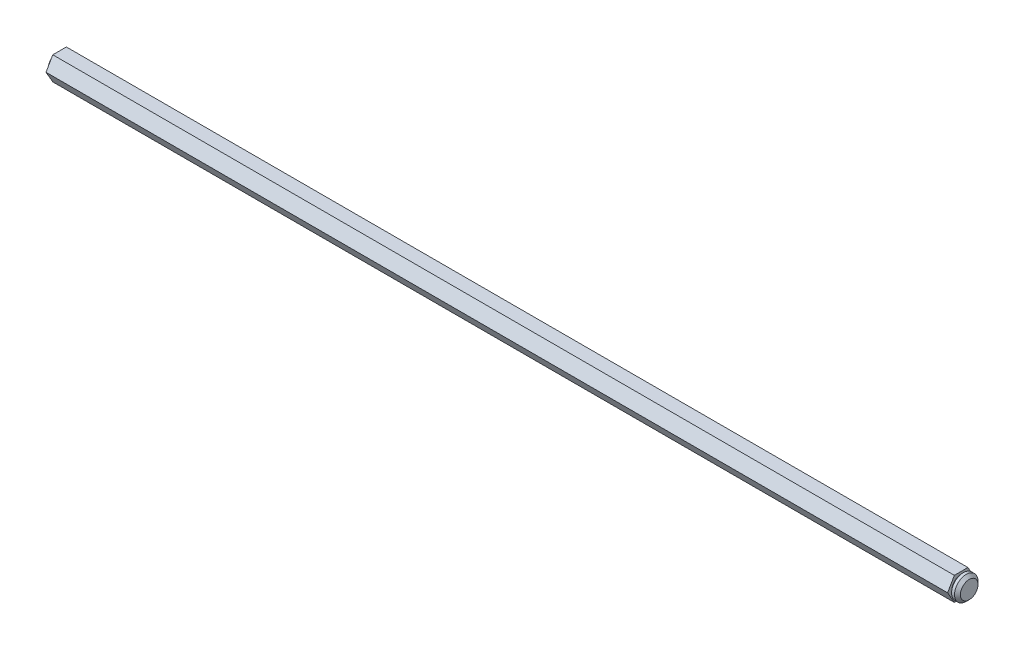
ISO-10303-21;
HEADER;
FILE_DESCRIPTION(('STEP AP214'),'2;1');
FILE_NAME('part.step','',(''),(''),'','','');
FILE_SCHEMA(('AUTOMOTIVE_DESIGN { 1 0 10303 214 1 1 1 1 }'));
ENDSEC;
DATA;
#1=APPLICATION_CONTEXT('core data for automotive mechanical design processes');
#2=APPLICATION_PROTOCOL_DEFINITION('international standard','automotive_design',2000,#1);
#3=PRODUCT_CONTEXT('',#1,'mechanical');
#4=PRODUCT('Part','Part','',(#3));
#5=PRODUCT_RELATED_PRODUCT_CATEGORY('part','',(#4));
#6=PRODUCT_DEFINITION_FORMATION('','',#4);
#7=PRODUCT_DEFINITION_CONTEXT('part definition',#1,'design');
#8=PRODUCT_DEFINITION('design','',#6,#7);
#9=PRODUCT_DEFINITION_SHAPE('','',#8);
#10=(LENGTH_UNIT() NAMED_UNIT(*) SI_UNIT(.MILLI.,.METRE.));
#11=(NAMED_UNIT(*) PLANE_ANGLE_UNIT() SI_UNIT($,.RADIAN.));
#12=(NAMED_UNIT(*) SI_UNIT($,.STERADIAN.) SOLID_ANGLE_UNIT());
#13=UNCERTAINTY_MEASURE_WITH_UNIT(LENGTH_MEASURE(1.E-05),#10,'distance_accuracy_value','');
#14=(GEOMETRIC_REPRESENTATION_CONTEXT(3) GLOBAL_UNCERTAINTY_ASSIGNED_CONTEXT((#13)) GLOBAL_UNIT_ASSIGNED_CONTEXT((#10,
#11,#12)) REPRESENTATION_CONTEXT('',''));
#15=CARTESIAN_POINT('',(0.,0.,0.));
#16=DIRECTION('',(0.,0.,1.));
#17=DIRECTION('',(1.,0.,0.));
#18=AXIS2_PLACEMENT_3D('',#15,#16,#17);
#19=CARTESIAN_POINT('',(248.02465,0.,0.));
#20=DIRECTION('',(-1.,0.,0.));
#21=DIRECTION('',(0.,0.,1.));
#22=AXIS2_PLACEMENT_3D('',#19,#20,#21);
#23=CYLINDRICAL_SURFACE('',#22,6.35);
#24=CARTESIAN_POINT('',(246.43715,0.,0.));
#25=DIRECTION('',(1.,0.,0.));
#26=DIRECTION('',(0.,0.,-1.));
#27=AXIS2_PLACEMENT_3D('',#24,#25,#26);
#28=CIRCLE('',#27,6.35);
#29=CARTESIAN_POINT('',(246.43715,0.,-6.35));
#30=VERTEX_POINT('',#29);
#31=EDGE_CURVE('E11',#30,#30,#28,.F.);
#32=ORIENTED_EDGE('',*,*,#31,.T.);
#33=EDGE_LOOP('',(#32));
#34=FACE_BOUND('',#33,.T.);
#35=CARTESIAN_POINT('',(244.84965,0.,0.));
#36=DIRECTION('',(1.,0.,0.));
#37=DIRECTION('',(0.,0.,-1.));
#38=AXIS2_PLACEMENT_3D('',#35,#36,#37);
#39=CIRCLE('',#38,6.35);
#40=CARTESIAN_POINT('',(244.84965,0.,-6.35));
#41=VERTEX_POINT('',#40);
#42=EDGE_CURVE('E54',#41,#41,#39,.T.);
#43=ORIENTED_EDGE('',*,*,#42,.T.);
#44=EDGE_LOOP('',(#43));
#45=FACE_BOUND('',#44,.T.);
#46=ADVANCED_FACE('F43',(#34,#45),#23,.T.);
#47=CARTESIAN_POINT('',(248.02465,0.,0.));
#48=DIRECTION('',(1.,0.,0.));
#49=DIRECTION('',(0.,0.,-1.));
#50=AXIS2_PLACEMENT_3D('',#47,#48,#49);
#51=PLANE('',#50);
#52=CARTESIAN_POINT('',(248.02465,0.,0.));
#53=DIRECTION('',(1.,0.,0.));
#54=DIRECTION('',(0.,0.,-1.));
#55=AXIS2_PLACEMENT_3D('',#52,#53,#54);
#56=CIRCLE('',#55,4.76249999999999);
#57=CARTESIAN_POINT('',(248.02465,0.,-4.76249999999999));
#58=VERTEX_POINT('',#57);
#59=EDGE_CURVE('E50',#58,#58,#56,.T.);
#60=ORIENTED_EDGE('',*,*,#59,.T.);
#61=EDGE_LOOP('',(#60));
#62=FACE_BOUND('',#61,.T.);
#63=ADVANCED_FACE('F64',(#62),#51,.T.);
#64=CARTESIAN_POINT('',(244.84965,0.,0.));
#65=DIRECTION('',(1.,0.,0.));
#66=DIRECTION('',(0.,0.,-1.));
#67=AXIS2_PLACEMENT_3D('',#64,#65,#66);
#68=PLANE('',#67);
#69=ORIENTED_EDGE('',*,*,#42,.F.);
#70=EDGE_LOOP('',(#69));
#71=FACE_BOUND('',#70,.T.);
#72=ADVANCED_FACE('F62',(#71),#68,.F.);
#73=CARTESIAN_POINT('',(248.02465,0.,0.));
#74=DIRECTION('',(-1.,0.,0.));
#75=DIRECTION('',(0.,0.,1.));
#76=AXIS2_PLACEMENT_3D('',#73,#74,#75);
#77=CONICAL_SURFACE('',#76,4.76249999999999,0.785398163397452);
#78=ORIENTED_EDGE('',*,*,#31,.F.);
#79=EDGE_LOOP('',(#78));
#80=FACE_BOUND('',#79,.T.);
#81=ORIENTED_EDGE('',*,*,#59,.F.);
#82=EDGE_LOOP('',(#81));
#83=FACE_BOUND('',#82,.T.);
#84=ADVANCED_FACE('F45',(#80,#83),#77,.T.);
#85=CLOSED_SHELL('',(#46,#63,#72,#84));
#86=MANIFOLD_SOLID_BREP('B2',#85);
#87=CARTESIAN_POINT('',(243.68125,6.35,-3.66617420935413));
#88=DIRECTION('',(0.,-1.,0.));
#89=DIRECTION('',(0.,0.,-1.));
#90=AXIS2_PLACEMENT_3D('',#87,#88,#89);
#91=PLANE('',#90);
#92=DIRECTION('',(0.,0.,1.));
#93=VECTOR('',#92,1.);
#94=CARTESIAN_POINT('',(-243.68125,6.35,-3.66617420935413));
#95=LINE('',#94,#93);
#96=CARTESIAN_POINT('',(-243.68125,6.35,-3.66617420935413));
#97=VERTEX_POINT('',#96);
#98=CARTESIAN_POINT('',(-243.68125,6.35,3.66617420935412));
#99=VERTEX_POINT('',#98);
#100=EDGE_CURVE('E185',#97,#99,#95,.T.);
#101=ORIENTED_EDGE('',*,*,#100,.T.);
#102=DIRECTION('',(-1.,0.,0.));
#103=VECTOR('',#102,1.);
#104=CARTESIAN_POINT('',(243.68125,6.35,3.66617420935412));
#105=LINE('',#104,#103);
#106=CARTESIAN_POINT('',(243.68125,6.35,3.66617420935412));
#107=VERTEX_POINT('',#106);
#108=EDGE_CURVE('E102',#107,#99,#105,.T.);
#109=ORIENTED_EDGE('',*,*,#108,.F.);
#110=DIRECTION('',(0.,0.,1.));
#111=VECTOR('',#110,1.);
#112=CARTESIAN_POINT('',(243.68125,6.35,-3.66617420935413));
#113=LINE('',#112,#111);
#114=CARTESIAN_POINT('',(243.68125,6.35,-3.66617420935413));
#115=VERTEX_POINT('',#114);
#116=EDGE_CURVE('E196',#115,#107,#113,.T.);
#117=ORIENTED_EDGE('',*,*,#116,.F.);
#118=DIRECTION('',(-1.,0.,0.));
#119=VECTOR('',#118,1.);
#120=CARTESIAN_POINT('',(243.68125,6.35,-3.66617420935413));
#121=LINE('',#120,#119);
#122=EDGE_CURVE('E181',#115,#97,#121,.T.);
#123=ORIENTED_EDGE('',*,*,#122,.T.);
#124=EDGE_LOOP('',(#101,#109,#117,#123));
#125=FACE_BOUND('',#124,.T.);
#126=ADVANCED_FACE('F99',(#125),#91,.F.);
#127=CARTESIAN_POINT('',(243.68125,6.35,3.66617420935412));
#128=DIRECTION('',(0.,-0.5,-0.866025403784439));
#129=DIRECTION('',(0.,0.866025403784439,-0.5));
#130=AXIS2_PLACEMENT_3D('',#127,#128,#129);
#131=PLANE('',#130);
#132=DIRECTION('',(0.,-0.866025403784438,0.5));
#133=VECTOR('',#132,1.);
#134=CARTESIAN_POINT('',(-243.68125,6.35,3.66617420935412));
#135=LINE('',#134,#133);
#136=CARTESIAN_POINT('',(-243.68125,0.,7.33234841870825));
#137=VERTEX_POINT('',#136);
#138=EDGE_CURVE('E188',#99,#137,#135,.T.);
#139=ORIENTED_EDGE('',*,*,#138,.T.);
#140=DIRECTION('',(-1.,0.,0.));
#141=VECTOR('',#140,1.);
#142=CARTESIAN_POINT('',(243.68125,0.,7.33234841870825));
#143=LINE('',#142,#141);
#144=CARTESIAN_POINT('',(243.68125,0.,7.33234841870825));
#145=VERTEX_POINT('',#144);
#146=EDGE_CURVE('E199',#145,#137,#143,.T.);
#147=ORIENTED_EDGE('',*,*,#146,.F.);
#148=DIRECTION('',(0.,-0.866025403784438,0.5));
#149=VECTOR('',#148,1.);
#150=CARTESIAN_POINT('',(243.68125,6.35,3.66617420935412));
#151=LINE('',#150,#149);
#152=EDGE_CURVE('E154',#107,#145,#151,.T.);
#153=ORIENTED_EDGE('',*,*,#152,.F.);
#154=ORIENTED_EDGE('',*,*,#108,.T.);
#155=EDGE_LOOP('',(#139,#147,#153,#154));
#156=FACE_BOUND('',#155,.T.);
#157=ADVANCED_FACE('F204',(#156),#131,.F.);
#158=CARTESIAN_POINT('',(243.68125,0.,7.33234841870825));
#159=DIRECTION('',(0.,0.5,-0.866025403784438));
#160=DIRECTION('',(0.,0.866025403784439,0.5));
#161=AXIS2_PLACEMENT_3D('',#158,#159,#160);
#162=PLANE('',#161);
#163=DIRECTION('',(0.,-0.866025403784439,-0.5));
#164=VECTOR('',#163,1.);
#165=CARTESIAN_POINT('',(-243.68125,0.,7.33234841870825));
#166=LINE('',#165,#164);
#167=CARTESIAN_POINT('',(-243.68125,-6.35,3.66617420935412));
#168=VERTEX_POINT('',#167);
#169=EDGE_CURVE('E191',#137,#168,#166,.T.);
#170=ORIENTED_EDGE('',*,*,#169,.T.);
#171=DIRECTION('',(-1.,0.,0.));
#172=VECTOR('',#171,1.);
#173=CARTESIAN_POINT('',(243.68125,-6.35,3.66617420935412));
#174=LINE('',#173,#172);
#175=CARTESIAN_POINT('',(243.68125,-6.35,3.66617420935412));
#176=VERTEX_POINT('',#175);
#177=EDGE_CURVE('E176',#176,#168,#174,.T.);
#178=ORIENTED_EDGE('',*,*,#177,.F.);
#179=DIRECTION('',(0.,-0.866025403784439,-0.5));
#180=VECTOR('',#179,1.);
#181=CARTESIAN_POINT('',(243.68125,0.,7.33234841870825));
#182=LINE('',#181,#180);
#183=EDGE_CURVE('E167',#145,#176,#182,.T.);
#184=ORIENTED_EDGE('',*,*,#183,.F.);
#185=ORIENTED_EDGE('',*,*,#146,.T.);
#186=EDGE_LOOP('',(#170,#178,#184,#185));
#187=FACE_BOUND('',#186,.T.);
#188=ADVANCED_FACE('F210',(#187),#162,.F.);
#189=CARTESIAN_POINT('',(243.68125,-6.35,3.66617420935412));
#190=DIRECTION('',(0.,1.,0.));
#191=DIRECTION('',(0.,0.,1.));
#192=AXIS2_PLACEMENT_3D('',#189,#190,#191);
#193=PLANE('',#192);
#194=DIRECTION('',(0.,0.,-1.));
#195=VECTOR('',#194,1.);
#196=CARTESIAN_POINT('',(-243.68125,-6.35,3.66617420935412));
#197=LINE('',#196,#195);
#198=CARTESIAN_POINT('',(-243.68125,-6.35,-3.66617420935413));
#199=VERTEX_POINT('',#198);
#200=EDGE_CURVE('E175',#168,#199,#197,.T.);
#201=ORIENTED_EDGE('',*,*,#200,.T.);
#202=DIRECTION('',(-1.,0.,0.));
#203=VECTOR('',#202,1.);
#204=CARTESIAN_POINT('',(243.68125,-6.35,-3.66617420935413));
#205=LINE('',#204,#203);
#206=CARTESIAN_POINT('',(243.68125,-6.35,-3.66617420935413));
#207=VERTEX_POINT('',#206);
#208=EDGE_CURVE('E172',#207,#199,#205,.T.);
#209=ORIENTED_EDGE('',*,*,#208,.F.);
#210=DIRECTION('',(0.,0.,-1.));
#211=VECTOR('',#210,1.);
#212=CARTESIAN_POINT('',(243.68125,-6.35,3.66617420935412));
#213=LINE('',#212,#211);
#214=EDGE_CURVE('E161',#176,#207,#213,.T.);
#215=ORIENTED_EDGE('',*,*,#214,.F.);
#216=ORIENTED_EDGE('',*,*,#177,.T.);
#217=EDGE_LOOP('',(#201,#209,#215,#216));
#218=FACE_BOUND('',#217,.T.);
#219=ADVANCED_FACE('F173',(#218),#193,.F.);
#220=CARTESIAN_POINT('',(243.68125,-6.35,-3.66617420935413));
#221=DIRECTION('',(0.,0.5,0.866025403784439));
#222=DIRECTION('',(0.,-0.866025403784439,0.5));
#223=AXIS2_PLACEMENT_3D('',#220,#221,#222);
#224=PLANE('',#223);
#225=DIRECTION('',(0.,0.866025403784438,-0.5));
#226=VECTOR('',#225,1.);
#227=CARTESIAN_POINT('',(-243.68125,-6.35,-3.66617420935413));
#228=LINE('',#227,#226);
#229=CARTESIAN_POINT('',(-243.68125,0.,-7.33234841870825));
#230=VERTEX_POINT('',#229);
#231=EDGE_CURVE('E139',#199,#230,#228,.T.);
#232=ORIENTED_EDGE('',*,*,#231,.T.);
#233=DIRECTION('',(-1.,0.,0.));
#234=VECTOR('',#233,1.);
#235=CARTESIAN_POINT('',(243.68125,0.,-7.33234841870825));
#236=LINE('',#235,#234);
#237=CARTESIAN_POINT('',(243.68125,0.,-7.33234841870825));
#238=VERTEX_POINT('',#237);
#239=EDGE_CURVE('E177',#238,#230,#236,.T.);
#240=ORIENTED_EDGE('',*,*,#239,.F.);
#241=DIRECTION('',(0.,0.866025403784438,-0.5));
#242=VECTOR('',#241,1.);
#243=CARTESIAN_POINT('',(243.68125,-6.35,-3.66617420935413));
#244=LINE('',#243,#242);
#245=EDGE_CURVE('E165',#207,#238,#244,.T.);
#246=ORIENTED_EDGE('',*,*,#245,.F.);
#247=ORIENTED_EDGE('',*,*,#208,.T.);
#248=EDGE_LOOP('',(#232,#240,#246,#247));
#249=FACE_BOUND('',#248,.T.);
#250=ADVANCED_FACE('F179',(#249),#224,.F.);
#251=CARTESIAN_POINT('',(243.68125,0.,-7.33234841870825));
#252=DIRECTION('',(0.,-0.5,0.866025403784439));
#253=DIRECTION('',(0.,-0.866025403784439,-0.5));
#254=AXIS2_PLACEMENT_3D('',#251,#252,#253);
#255=PLANE('',#254);
#256=DIRECTION('',(0.,0.866025403784439,0.5));
#257=VECTOR('',#256,1.);
#258=CARTESIAN_POINT('',(-243.68125,0.,-7.33234841870825));
#259=LINE('',#258,#257);
#260=EDGE_CURVE('E145',#230,#97,#259,.T.);
#261=ORIENTED_EDGE('',*,*,#260,.T.);
#262=ORIENTED_EDGE('',*,*,#122,.F.);
#263=DIRECTION('',(0.,0.866025403784439,0.5));
#264=VECTOR('',#263,1.);
#265=CARTESIAN_POINT('',(243.68125,0.,-7.33234841870825));
#266=LINE('',#265,#264);
#267=EDGE_CURVE('E116',#238,#115,#266,.T.);
#268=ORIENTED_EDGE('',*,*,#267,.F.);
#269=ORIENTED_EDGE('',*,*,#239,.T.);
#270=EDGE_LOOP('',(#261,#262,#268,#269));
#271=FACE_BOUND('',#270,.T.);
#272=ADVANCED_FACE('F252',(#271),#255,.F.);
#273=CARTESIAN_POINT('',(243.68125,0.,0.));
#274=DIRECTION('',(1.,0.,0.));
#275=DIRECTION('',(0.,0.,-1.));
#276=AXIS2_PLACEMENT_3D('',#273,#274,#275);
#277=PLANE('',#276);
#278=CARTESIAN_POINT('',(243.68125,0.,0.));
#279=DIRECTION('',(1.,0.,0.));
#280=DIRECTION('',(0.,0.,-1.));
#281=AXIS2_PLACEMENT_3D('',#278,#279,#280);
#282=CIRCLE('',#281,5.0292);
#283=CARTESIAN_POINT('',(243.68125,0.,-5.0292));
#284=VERTEX_POINT('',#283);
#285=EDGE_CURVE('E41',#284,#284,#282,.T.);
#286=ORIENTED_EDGE('',*,*,#285,.F.);
#287=EDGE_LOOP('',(#286));
#288=FACE_BOUND('',#287,.T.);
#289=ORIENTED_EDGE('',*,*,#116,.T.);
#290=ORIENTED_EDGE('',*,*,#152,.T.);
#291=ORIENTED_EDGE('',*,*,#183,.T.);
#292=ORIENTED_EDGE('',*,*,#214,.T.);
#293=ORIENTED_EDGE('',*,*,#245,.T.);
#294=ORIENTED_EDGE('',*,*,#267,.T.);
#295=EDGE_LOOP('',(#289,#290,#291,#292,#293,#294));
#296=FACE_BOUND('',#295,.T.);
#297=ADVANCED_FACE('F163',(#288,#296),#277,.T.);
#298=CARTESIAN_POINT('',(-243.68125,0.,0.));
#299=DIRECTION('',(1.,0.,0.));
#300=DIRECTION('',(0.,0.,-1.));
#301=AXIS2_PLACEMENT_3D('',#298,#299,#300);
#302=PLANE('',#301);
#303=CARTESIAN_POINT('',(-243.68125,0.,0.));
#304=DIRECTION('',(1.,0.,0.));
#305=DIRECTION('',(0.,0.,-1.));
#306=AXIS2_PLACEMENT_3D('',#303,#304,#305);
#307=CIRCLE('',#306,5.0292);
#308=CARTESIAN_POINT('',(-243.68125,0.,-5.0292));
#309=VERTEX_POINT('',#308);
#310=EDGE_CURVE('E219',#309,#309,#307,.T.);
#311=ORIENTED_EDGE('',*,*,#310,.T.);
#312=EDGE_LOOP('',(#311));
#313=FACE_BOUND('',#312,.T.);
#314=ORIENTED_EDGE('',*,*,#100,.F.);
#315=ORIENTED_EDGE('',*,*,#260,.F.);
#316=ORIENTED_EDGE('',*,*,#231,.F.);
#317=ORIENTED_EDGE('',*,*,#200,.F.);
#318=ORIENTED_EDGE('',*,*,#169,.F.);
#319=ORIENTED_EDGE('',*,*,#138,.F.);
#320=EDGE_LOOP('',(#314,#315,#316,#317,#318,#319));
#321=FACE_BOUND('',#320,.T.);
#322=ADVANCED_FACE('F209',(#313,#321),#302,.F.);
#323=CARTESIAN_POINT('',(244.84965,0.,0.));
#324=DIRECTION('',(-1.,0.,0.));
#325=DIRECTION('',(0.,0.,1.));
#326=AXIS2_PLACEMENT_3D('',#323,#324,#325);
#327=CYLINDRICAL_SURFACE('',#326,5.0292);
#328=CARTESIAN_POINT('',(244.84965,0.,0.));
#329=DIRECTION('',(1.,0.,0.));
#330=DIRECTION('',(0.,0.,-1.));
#331=AXIS2_PLACEMENT_3D('',#328,#329,#330);
#332=CIRCLE('',#331,5.0292);
#333=CARTESIAN_POINT('',(244.84965,0.,-5.0292));
#334=VERTEX_POINT('',#333);
#335=EDGE_CURVE('E189',#334,#334,#332,.T.);
#336=ORIENTED_EDGE('',*,*,#335,.F.);
#337=EDGE_LOOP('',(#336));
#338=FACE_BOUND('',#337,.T.);
#339=ORIENTED_EDGE('',*,*,#285,.T.);
#340=EDGE_LOOP('',(#339));
#341=FACE_BOUND('',#340,.T.);
#342=ADVANCED_FACE('F236',(#338,#341),#327,.T.);
#343=CARTESIAN_POINT('',(244.84965,0.,0.));
#344=DIRECTION('',(1.,0.,0.));
#345=DIRECTION('',(0.,0.,-1.));
#346=AXIS2_PLACEMENT_3D('',#343,#344,#345);
#347=PLANE('',#346);
#348=ORIENTED_EDGE('',*,*,#335,.T.);
#349=EDGE_LOOP('',(#348));
#350=FACE_BOUND('',#349,.T.);
#351=ADVANCED_FACE('F227',(#350),#347,.T.);
#352=CARTESIAN_POINT('',(-244.84965,0.,0.));
#353=DIRECTION('',(1.,0.,0.));
#354=DIRECTION('',(0.,0.,1.));
#355=AXIS2_PLACEMENT_3D('',#352,#353,#354);
#356=CYLINDRICAL_SURFACE('',#355,5.0292);
#357=CARTESIAN_POINT('',(-244.84965,0.,0.));
#358=DIRECTION('',(1.,0.,0.));
#359=DIRECTION('',(0.,0.,-1.));
#360=AXIS2_PLACEMENT_3D('',#357,#358,#359);
#361=CIRCLE('',#360,5.0292);
#362=CARTESIAN_POINT('',(-244.84965,0.,-5.0292));
#363=VERTEX_POINT('',#362);
#364=EDGE_CURVE('E216',#363,#363,#361,.T.);
#365=ORIENTED_EDGE('',*,*,#364,.T.);
#366=EDGE_LOOP('',(#365));
#367=FACE_BOUND('',#366,.T.);
#368=ORIENTED_EDGE('',*,*,#310,.F.);
#369=EDGE_LOOP('',(#368));
#370=FACE_BOUND('',#369,.T.);
#371=ADVANCED_FACE('F224',(#367,#370),#356,.T.);
#372=CARTESIAN_POINT('',(-244.84965,0.,0.));
#373=DIRECTION('',(-1.,0.,0.));
#374=DIRECTION('',(0.,0.,-1.));
#375=AXIS2_PLACEMENT_3D('',#372,#373,#374);
#376=PLANE('',#375);
#377=ORIENTED_EDGE('',*,*,#364,.F.);
#378=EDGE_LOOP('',(#377));
#379=FACE_BOUND('',#378,.T.);
#380=ADVANCED_FACE('F226',(#379),#376,.T.);
#381=CLOSED_SHELL('',(#126,#157,#188,#219,#250,#272,#297,#322,#342,#351,#371,#380));
#382=MANIFOLD_SOLID_BREP('B6',#381);
#383=ADVANCED_BREP_SHAPE_REPRESENTATION('',(#18,#86,#382),#14);
#384=SHAPE_DEFINITION_REPRESENTATION(#9,#383);
ENDSEC;
END-ISO-10303-21;
